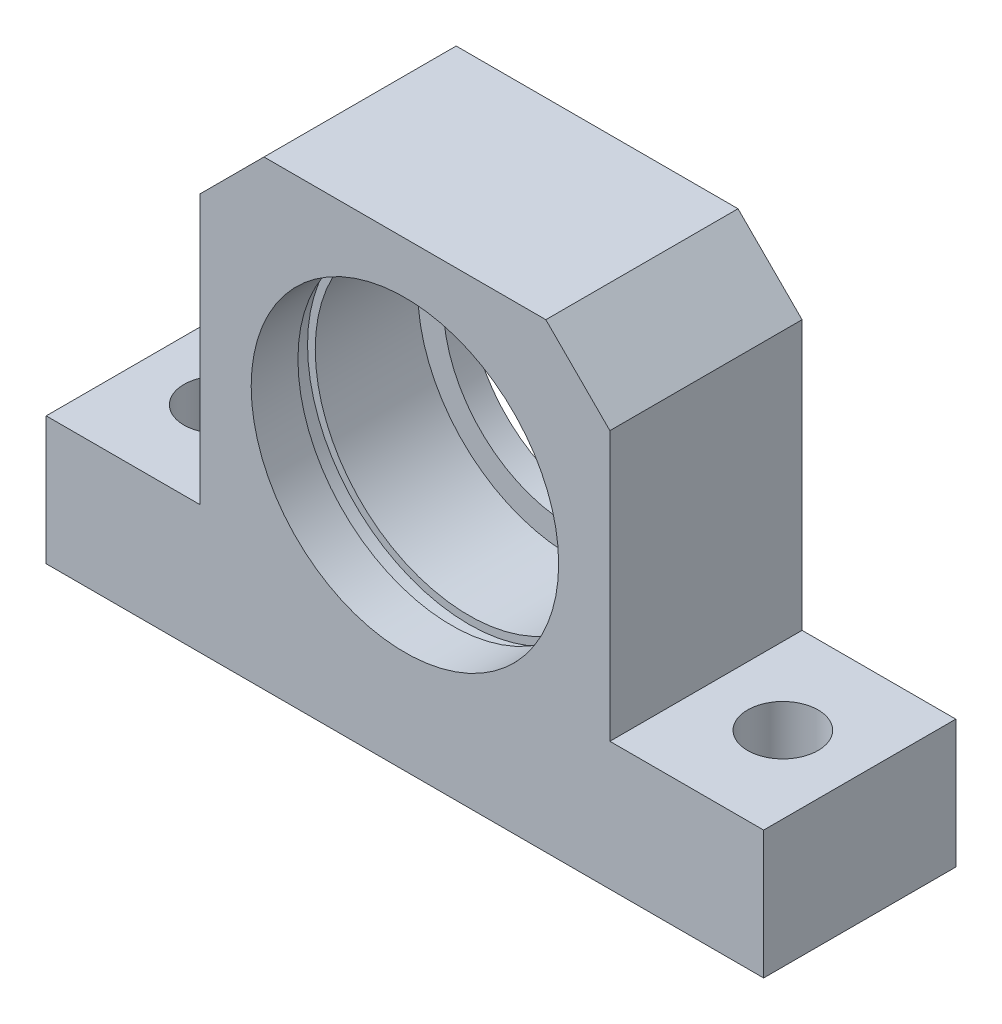
ISO-10303-21;
HEADER;
FILE_DESCRIPTION(('STEP AP214'),'2;1');
FILE_NAME('part.step','',(''),(''),'','','');
FILE_SCHEMA(('AUTOMOTIVE_DESIGN { 1 0 10303 214 1 1 1 1 }'));
ENDSEC;
DATA;
#1=APPLICATION_CONTEXT('core data for automotive mechanical design processes');
#2=APPLICATION_PROTOCOL_DEFINITION('international standard','automotive_design',2000,#1);
#3=PRODUCT_CONTEXT('',#1,'mechanical');
#4=PRODUCT('Part','Part','',(#3));
#5=PRODUCT_RELATED_PRODUCT_CATEGORY('part','',(#4));
#6=PRODUCT_DEFINITION_FORMATION('','',#4);
#7=PRODUCT_DEFINITION_CONTEXT('part definition',#1,'design');
#8=PRODUCT_DEFINITION('design','',#6,#7);
#9=PRODUCT_DEFINITION_SHAPE('','',#8);
#10=(LENGTH_UNIT() NAMED_UNIT(*) SI_UNIT(.MILLI.,.METRE.));
#11=(NAMED_UNIT(*) PLANE_ANGLE_UNIT() SI_UNIT($,.RADIAN.));
#12=(NAMED_UNIT(*) SI_UNIT($,.STERADIAN.) SOLID_ANGLE_UNIT());
#13=UNCERTAINTY_MEASURE_WITH_UNIT(LENGTH_MEASURE(1.E-05),#10,'distance_accuracy_value','');
#14=(GEOMETRIC_REPRESENTATION_CONTEXT(3) GLOBAL_UNCERTAINTY_ASSIGNED_CONTEXT((#13)) GLOBAL_UNIT_ASSIGNED_CONTEXT((#10,
#11,#12)) REPRESENTATION_CONTEXT('',''));
#15=CARTESIAN_POINT('',(0.,0.,0.));
#16=DIRECTION('',(0.,0.,1.));
#17=DIRECTION('',(1.,0.,0.));
#18=AXIS2_PLACEMENT_3D('',#15,#16,#17);
#19=CARTESIAN_POINT('',(28.,0.,-15.));
#20=DIRECTION('',(0.,-1.,0.));
#21=DIRECTION('',(0.,0.,-1.));
#22=AXIS2_PLACEMENT_3D('',#19,#20,#21);
#23=PLANE('',#22);
#24=CARTESIAN_POINT('',(-22.,0.,-7.5));
#25=DIRECTION('',(0.,1.,0.));
#26=DIRECTION('',(0.,0.,1.));
#27=AXIS2_PLACEMENT_3D('',#24,#25,#26);
#28=CIRCLE('',#27,2.75);
#29=CARTESIAN_POINT('',(-22.,0.,-4.75));
#30=VERTEX_POINT('',#29);
#31=EDGE_CURVE('E442',#30,#30,#28,.T.);
#32=ORIENTED_EDGE('',*,*,#31,.T.);
#33=EDGE_LOOP('',(#32));
#34=FACE_BOUND('',#33,.T.);
#35=DIRECTION('',(1.,0.,0.));
#36=VECTOR('',#35,1.);
#37=CARTESIAN_POINT('',(28.,0.,0.));
#38=LINE('',#37,#36);
#39=CARTESIAN_POINT('',(-28.,0.,0.));
#40=VERTEX_POINT('',#39);
#41=CARTESIAN_POINT('',(28.,0.,0.));
#42=VERTEX_POINT('',#41);
#43=EDGE_CURVE('E154',#40,#42,#38,.T.);
#44=ORIENTED_EDGE('',*,*,#43,.F.);
#45=DIRECTION('',(0.,0.,1.));
#46=VECTOR('',#45,1.);
#47=CARTESIAN_POINT('',(-28.,0.,-15.));
#48=LINE('',#47,#46);
#49=CARTESIAN_POINT('',(-28.,0.,-15.));
#50=VERTEX_POINT('',#49);
#51=EDGE_CURVE('E175',#50,#40,#48,.T.);
#52=ORIENTED_EDGE('',*,*,#51,.F.);
#53=DIRECTION('',(1.,0.,0.));
#54=VECTOR('',#53,1.);
#55=CARTESIAN_POINT('',(28.,0.,-15.));
#56=LINE('',#55,#54);
#57=CARTESIAN_POINT('',(28.,0.,-15.));
#58=VERTEX_POINT('',#57);
#59=EDGE_CURVE('E131',#50,#58,#56,.T.);
#60=ORIENTED_EDGE('',*,*,#59,.T.);
#61=DIRECTION('',(0.,0.,1.));
#62=VECTOR('',#61,1.);
#63=CARTESIAN_POINT('',(28.,0.,-15.));
#64=LINE('',#63,#62);
#65=EDGE_CURVE('E173',#58,#42,#64,.T.);
#66=ORIENTED_EDGE('',*,*,#65,.T.);
#67=EDGE_LOOP('',(#44,#52,#60,#66));
#68=FACE_BOUND('',#67,.T.);
#69=CARTESIAN_POINT('',(22.,0.,-7.5));
#70=DIRECTION('',(0.,1.,0.));
#71=DIRECTION('',(0.,0.,1.));
#72=AXIS2_PLACEMENT_3D('',#69,#70,#71);
#73=CIRCLE('',#72,2.75);
#74=CARTESIAN_POINT('',(22.,0.,-4.75));
#75=VERTEX_POINT('',#74);
#76=EDGE_CURVE('E436',#75,#75,#73,.T.);
#77=ORIENTED_EDGE('',*,*,#76,.T.);
#78=EDGE_LOOP('',(#77));
#79=FACE_BOUND('',#78,.T.);
#80=ADVANCED_FACE('F33',(#34,#68,#79),#23,.T.);
#81=CARTESIAN_POINT('',(-16.,9.99999999999999,-15.));
#82=DIRECTION('',(-1.,0.,0.));
#83=DIRECTION('',(0.,-1.,0.));
#84=AXIS2_PLACEMENT_3D('',#81,#82,#83);
#85=PLANE('',#84);
#86=DIRECTION('',(0.,-1.,0.));
#87=VECTOR('',#86,1.);
#88=CARTESIAN_POINT('',(-16.,9.99999999999999,0.));
#89=LINE('',#88,#87);
#90=CARTESIAN_POINT('',(-16.,31.,0.));
#91=VERTEX_POINT('',#90);
#92=CARTESIAN_POINT('',(-16.,9.99999999999999,0.));
#93=VERTEX_POINT('',#92);
#94=EDGE_CURVE('E147',#91,#93,#89,.T.);
#95=ORIENTED_EDGE('',*,*,#94,.F.);
#96=DIRECTION('',(0.,0.,-1.));
#97=VECTOR('',#96,1.);
#98=CARTESIAN_POINT('',(-16.,31.,-15.));
#99=LINE('',#98,#97);
#100=CARTESIAN_POINT('',(-16.,31.,-15.));
#101=VERTEX_POINT('',#100);
#102=EDGE_CURVE('E11',#91,#101,#99,.T.);
#103=ORIENTED_EDGE('',*,*,#102,.T.);
#104=DIRECTION('',(0.,-1.,0.));
#105=VECTOR('',#104,1.);
#106=CARTESIAN_POINT('',(-16.,9.99999999999999,-15.));
#107=LINE('',#106,#105);
#108=CARTESIAN_POINT('',(-16.,9.99999999999999,-15.));
#109=VERTEX_POINT('',#108);
#110=EDGE_CURVE('E108',#101,#109,#107,.T.);
#111=ORIENTED_EDGE('',*,*,#110,.T.);
#112=DIRECTION('',(0.,0.,1.));
#113=VECTOR('',#112,1.);
#114=CARTESIAN_POINT('',(-16.,9.99999999999999,-15.));
#115=LINE('',#114,#113);
#116=EDGE_CURVE('E111',#109,#93,#115,.T.);
#117=ORIENTED_EDGE('',*,*,#116,.T.);
#118=EDGE_LOOP('',(#95,#103,#111,#117));
#119=FACE_BOUND('',#118,.T.);
#120=ADVANCED_FACE('F110',(#119),#85,.T.);
#121=CARTESIAN_POINT('',(-16.,36.,-15.));
#122=DIRECTION('',(0.,1.,0.));
#123=DIRECTION('',(-1.,0.,0.));
#124=AXIS2_PLACEMENT_3D('',#121,#122,#123);
#125=PLANE('',#124);
#126=DIRECTION('',(-1.,0.,0.));
#127=VECTOR('',#126,1.);
#128=CARTESIAN_POINT('',(-16.,36.,0.));
#129=LINE('',#128,#127);
#130=CARTESIAN_POINT('',(11.,36.,0.));
#131=VERTEX_POINT('',#130);
#132=CARTESIAN_POINT('',(-11.,36.,0.));
#133=VERTEX_POINT('',#132);
#134=EDGE_CURVE('E115',#131,#133,#129,.T.);
#135=ORIENTED_EDGE('',*,*,#134,.F.);
#136=DIRECTION('',(0.,0.,-1.));
#137=VECTOR('',#136,1.);
#138=CARTESIAN_POINT('',(11.,36.,-15.));
#139=LINE('',#138,#137);
#140=CARTESIAN_POINT('',(11.,36.,-15.));
#141=VERTEX_POINT('',#140);
#142=EDGE_CURVE('E187',#131,#141,#139,.T.);
#143=ORIENTED_EDGE('',*,*,#142,.T.);
#144=DIRECTION('',(-1.,0.,0.));
#145=VECTOR('',#144,1.);
#146=CARTESIAN_POINT('',(-16.,36.,-15.));
#147=LINE('',#146,#145);
#148=CARTESIAN_POINT('',(-11.,36.,-15.));
#149=VERTEX_POINT('',#148);
#150=EDGE_CURVE('E123',#141,#149,#147,.T.);
#151=ORIENTED_EDGE('',*,*,#150,.T.);
#152=DIRECTION('',(0.,0.,1.));
#153=VECTOR('',#152,1.);
#154=CARTESIAN_POINT('',(-11.,36.,-15.));
#155=LINE('',#154,#153);
#156=EDGE_CURVE('E184',#149,#133,#155,.T.);
#157=ORIENTED_EDGE('',*,*,#156,.T.);
#158=EDGE_LOOP('',(#135,#143,#151,#157));
#159=FACE_BOUND('',#158,.T.);
#160=ADVANCED_FACE('F203',(#159),#125,.T.);
#161=CARTESIAN_POINT('',(16.,36.,-15.));
#162=DIRECTION('',(1.,0.,0.));
#163=DIRECTION('',(0.,1.,0.));
#164=AXIS2_PLACEMENT_3D('',#161,#162,#163);
#165=PLANE('',#164);
#166=DIRECTION('',(0.,1.,0.));
#167=VECTOR('',#166,1.);
#168=CARTESIAN_POINT('',(16.,36.,-15.));
#169=LINE('',#168,#167);
#170=CARTESIAN_POINT('',(16.,10.,-15.));
#171=VERTEX_POINT('',#170);
#172=CARTESIAN_POINT('',(16.,31.,-15.));
#173=VERTEX_POINT('',#172);
#174=EDGE_CURVE('E143',#171,#173,#169,.T.);
#175=ORIENTED_EDGE('',*,*,#174,.T.);
#176=DIRECTION('',(0.,0.,1.));
#177=VECTOR('',#176,1.);
#178=CARTESIAN_POINT('',(16.,31.,-15.));
#179=LINE('',#178,#177);
#180=CARTESIAN_POINT('',(16.,31.,0.));
#181=VERTEX_POINT('',#180);
#182=EDGE_CURVE('E170',#173,#181,#179,.T.);
#183=ORIENTED_EDGE('',*,*,#182,.T.);
#184=DIRECTION('',(0.,1.,0.));
#185=VECTOR('',#184,1.);
#186=CARTESIAN_POINT('',(16.,36.,0.));
#187=LINE('',#186,#185);
#188=CARTESIAN_POINT('',(16.,10.,0.));
#189=VERTEX_POINT('',#188);
#190=EDGE_CURVE('E163',#189,#181,#187,.T.);
#191=ORIENTED_EDGE('',*,*,#190,.F.);
#192=DIRECTION('',(0.,0.,1.));
#193=VECTOR('',#192,1.);
#194=CARTESIAN_POINT('',(16.,10.,-15.));
#195=LINE('',#194,#193);
#196=EDGE_CURVE('E168',#171,#189,#195,.T.);
#197=ORIENTED_EDGE('',*,*,#196,.F.);
#198=EDGE_LOOP('',(#175,#183,#191,#197));
#199=FACE_BOUND('',#198,.T.);
#200=ADVANCED_FACE('F196',(#199),#165,.T.);
#201=CARTESIAN_POINT('',(16.,10.,-15.));
#202=DIRECTION('',(0.,1.,0.));
#203=DIRECTION('',(-1.,0.,0.));
#204=AXIS2_PLACEMENT_3D('',#201,#202,#203);
#205=PLANE('',#204);
#206=CARTESIAN_POINT('',(22.,10.,-7.5));
#207=DIRECTION('',(0.,1.,0.));
#208=DIRECTION('',(0.,0.,1.));
#209=AXIS2_PLACEMENT_3D('',#206,#207,#208);
#210=CIRCLE('',#209,2.74999999999999);
#211=CARTESIAN_POINT('',(22.,10.,-4.75000000000001));
#212=VERTEX_POINT('',#211);
#213=EDGE_CURVE('E439',#212,#212,#210,.T.);
#214=ORIENTED_EDGE('',*,*,#213,.F.);
#215=EDGE_LOOP('',(#214));
#216=FACE_BOUND('',#215,.T.);
#217=DIRECTION('',(-1.,0.,0.));
#218=VECTOR('',#217,1.);
#219=CARTESIAN_POINT('',(16.,10.,0.));
#220=LINE('',#219,#218);
#221=CARTESIAN_POINT('',(28.,9.99999999999999,0.));
#222=VERTEX_POINT('',#221);
#223=EDGE_CURVE('E160',#222,#189,#220,.T.);
#224=ORIENTED_EDGE('',*,*,#223,.F.);
#225=DIRECTION('',(0.,0.,1.));
#226=VECTOR('',#225,1.);
#227=CARTESIAN_POINT('',(28.,9.99999999999999,-15.));
#228=LINE('',#227,#226);
#229=CARTESIAN_POINT('',(28.,9.99999999999999,-15.));
#230=VERTEX_POINT('',#229);
#231=EDGE_CURVE('E171',#230,#222,#228,.T.);
#232=ORIENTED_EDGE('',*,*,#231,.F.);
#233=DIRECTION('',(-1.,0.,0.));
#234=VECTOR('',#233,1.);
#235=CARTESIAN_POINT('',(16.,10.,-15.));
#236=LINE('',#235,#234);
#237=EDGE_CURVE('E140',#230,#171,#236,.T.);
#238=ORIENTED_EDGE('',*,*,#237,.T.);
#239=ORIENTED_EDGE('',*,*,#196,.T.);
#240=EDGE_LOOP('',(#224,#232,#238,#239));
#241=FACE_BOUND('',#240,.T.);
#242=ADVANCED_FACE('F218',(#216,#241),#205,.T.);
#243=CARTESIAN_POINT('',(28.,9.99999999999999,-15.));
#244=DIRECTION('',(1.,0.,0.));
#245=DIRECTION('',(0.,0.,-1.));
#246=AXIS2_PLACEMENT_3D('',#243,#244,#245);
#247=PLANE('',#246);
#248=DIRECTION('',(0.,1.,0.));
#249=VECTOR('',#248,1.);
#250=CARTESIAN_POINT('',(28.,9.99999999999999,0.));
#251=LINE('',#250,#249);
#252=EDGE_CURVE('E157',#42,#222,#251,.T.);
#253=ORIENTED_EDGE('',*,*,#252,.F.);
#254=ORIENTED_EDGE('',*,*,#65,.F.);
#255=DIRECTION('',(0.,1.,0.));
#256=VECTOR('',#255,1.);
#257=CARTESIAN_POINT('',(28.,9.99999999999999,-15.));
#258=LINE('',#257,#256);
#259=EDGE_CURVE('E137',#58,#230,#258,.T.);
#260=ORIENTED_EDGE('',*,*,#259,.T.);
#261=ORIENTED_EDGE('',*,*,#231,.T.);
#262=EDGE_LOOP('',(#253,#254,#260,#261));
#263=FACE_BOUND('',#262,.T.);
#264=ADVANCED_FACE('F215',(#263),#247,.T.);
#265=CARTESIAN_POINT('',(-28.,0.,-15.));
#266=DIRECTION('',(-1.,0.,0.));
#267=DIRECTION('',(0.,0.,1.));
#268=AXIS2_PLACEMENT_3D('',#265,#266,#267);
#269=PLANE('',#268);
#270=DIRECTION('',(0.,-1.,0.));
#271=VECTOR('',#270,1.);
#272=CARTESIAN_POINT('',(-28.,0.,0.));
#273=LINE('',#272,#271);
#274=CARTESIAN_POINT('',(-28.,9.99999999999999,0.));
#275=VERTEX_POINT('',#274);
#276=EDGE_CURVE('E151',#275,#40,#273,.T.);
#277=ORIENTED_EDGE('',*,*,#276,.F.);
#278=DIRECTION('',(0.,0.,1.));
#279=VECTOR('',#278,1.);
#280=CARTESIAN_POINT('',(-28.,9.99999999999999,-15.));
#281=LINE('',#280,#279);
#282=CARTESIAN_POINT('',(-28.,9.99999999999999,-15.));
#283=VERTEX_POINT('',#282);
#284=EDGE_CURVE('E122',#283,#275,#281,.T.);
#285=ORIENTED_EDGE('',*,*,#284,.F.);
#286=DIRECTION('',(0.,-1.,0.));
#287=VECTOR('',#286,1.);
#288=CARTESIAN_POINT('',(-28.,0.,-15.));
#289=LINE('',#288,#287);
#290=EDGE_CURVE('E129',#283,#50,#289,.T.);
#291=ORIENTED_EDGE('',*,*,#290,.T.);
#292=ORIENTED_EDGE('',*,*,#51,.T.);
#293=EDGE_LOOP('',(#277,#285,#291,#292));
#294=FACE_BOUND('',#293,.T.);
#295=ADVANCED_FACE('F209',(#294),#269,.T.);
#296=CARTESIAN_POINT('',(-28.,9.99999999999999,-15.));
#297=DIRECTION('',(0.,1.,0.));
#298=DIRECTION('',(0.,0.,1.));
#299=AXIS2_PLACEMENT_3D('',#296,#297,#298);
#300=PLANE('',#299);
#301=CARTESIAN_POINT('',(-22.,10.,-7.5));
#302=DIRECTION('',(0.,1.,0.));
#303=DIRECTION('',(0.,0.,1.));
#304=AXIS2_PLACEMENT_3D('',#301,#302,#303);
#305=CIRCLE('',#304,2.74999999999999);
#306=CARTESIAN_POINT('',(-22.,10.,-4.75000000000001));
#307=VERTEX_POINT('',#306);
#308=EDGE_CURVE('E444',#307,#307,#305,.T.);
#309=ORIENTED_EDGE('',*,*,#308,.F.);
#310=EDGE_LOOP('',(#309));
#311=FACE_BOUND('',#310,.T.);
#312=DIRECTION('',(-1.,0.,0.));
#313=VECTOR('',#312,1.);
#314=CARTESIAN_POINT('',(-28.,9.99999999999999,0.));
#315=LINE('',#314,#313);
#316=EDGE_CURVE('E121',#93,#275,#315,.T.);
#317=ORIENTED_EDGE('',*,*,#316,.F.);
#318=ORIENTED_EDGE('',*,*,#116,.F.);
#319=DIRECTION('',(-1.,0.,0.));
#320=VECTOR('',#319,1.);
#321=CARTESIAN_POINT('',(-28.,9.99999999999999,-15.));
#322=LINE('',#321,#320);
#323=EDGE_CURVE('E114',#109,#283,#322,.T.);
#324=ORIENTED_EDGE('',*,*,#323,.T.);
#325=ORIENTED_EDGE('',*,*,#284,.T.);
#326=EDGE_LOOP('',(#317,#318,#324,#325));
#327=FACE_BOUND('',#326,.T.);
#328=ADVANCED_FACE('F119',(#311,#327),#300,.T.);
#329=CARTESIAN_POINT('',(0.,0.,-15.));
#330=DIRECTION('',(0.,0.,-1.));
#331=DIRECTION('',(-1.,0.,0.));
#332=AXIS2_PLACEMENT_3D('',#329,#330,#331);
#333=PLANE('',#332);
#334=CARTESIAN_POINT('',(0.,20.,-15.));
#335=DIRECTION('',(0.,0.,-1.));
#336=DIRECTION('',(-1.,0.,0.));
#337=AXIS2_PLACEMENT_3D('',#334,#335,#336);
#338=CIRCLE('',#337,10.);
#339=CARTESIAN_POINT('',(-10.,20.,-15.));
#340=VERTEX_POINT('',#339);
#341=EDGE_CURVE('E414',#340,#340,#338,.T.);
#342=ORIENTED_EDGE('',*,*,#341,.F.);
#343=EDGE_LOOP('',(#342));
#344=FACE_BOUND('',#343,.T.);
#345=ORIENTED_EDGE('',*,*,#150,.F.);
#346=DIRECTION('',(-0.70710678118655,0.707106781186546,0.));
#347=VECTOR('',#346,1.);
#348=CARTESIAN_POINT('',(23.5,23.5000000000001,-15.));
#349=LINE('',#348,#347);
#350=EDGE_CURVE('E41',#141,#173,#349,.F.);
#351=ORIENTED_EDGE('',*,*,#350,.T.);
#352=ORIENTED_EDGE('',*,*,#174,.F.);
#353=ORIENTED_EDGE('',*,*,#237,.F.);
#354=ORIENTED_EDGE('',*,*,#259,.F.);
#355=ORIENTED_EDGE('',*,*,#59,.F.);
#356=ORIENTED_EDGE('',*,*,#290,.F.);
#357=ORIENTED_EDGE('',*,*,#323,.F.);
#358=ORIENTED_EDGE('',*,*,#110,.F.);
#359=DIRECTION('',(-0.707106781186546,-0.707106781186549,0.));
#360=VECTOR('',#359,1.);
#361=CARTESIAN_POINT('',(-23.5,23.4999999999999,-15.));
#362=LINE('',#361,#360);
#363=EDGE_CURVE('E53',#101,#149,#362,.F.);
#364=ORIENTED_EDGE('',*,*,#363,.T.);
#365=EDGE_LOOP('',(#345,#351,#352,#353,#354,#355,#356,#357,#358,#364));
#366=FACE_BOUND('',#365,.T.);
#367=ADVANCED_FACE('F126',(#344,#366),#333,.T.);
#368=CARTESIAN_POINT('',(0.,0.,0.));
#369=DIRECTION('',(0.,0.,-1.));
#370=DIRECTION('',(-1.,0.,0.));
#371=AXIS2_PLACEMENT_3D('',#368,#369,#370);
#372=PLANE('',#371);
#373=CARTESIAN_POINT('',(0.,20.,0.));
#374=DIRECTION('',(0.,0.,-1.));
#375=DIRECTION('',(-1.,0.,0.));
#376=AXIS2_PLACEMENT_3D('',#373,#374,#375);
#377=CIRCLE('',#376,12.);
#378=CARTESIAN_POINT('',(-12.,20.,0.));
#379=VERTEX_POINT('',#378);
#380=EDGE_CURVE('E149',#379,#379,#377,.T.);
#381=ORIENTED_EDGE('',*,*,#380,.T.);
#382=EDGE_LOOP('',(#381));
#383=FACE_BOUND('',#382,.T.);
#384=ORIENTED_EDGE('',*,*,#190,.T.);
#385=DIRECTION('',(0.70710678118655,-0.707106781186546,0.));
#386=VECTOR('',#385,1.);
#387=CARTESIAN_POINT('',(16.,31.,0.));
#388=LINE('',#387,#386);
#389=EDGE_CURVE('E182',#181,#131,#388,.F.);
#390=ORIENTED_EDGE('',*,*,#389,.T.);
#391=ORIENTED_EDGE('',*,*,#134,.T.);
#392=DIRECTION('',(0.707106781186546,0.707106781186549,0.));
#393=VECTOR('',#392,1.);
#394=CARTESIAN_POINT('',(-11.,36.,0.));
#395=LINE('',#394,#393);
#396=EDGE_CURVE('E180',#133,#91,#395,.F.);
#397=ORIENTED_EDGE('',*,*,#396,.T.);
#398=ORIENTED_EDGE('',*,*,#94,.T.);
#399=ORIENTED_EDGE('',*,*,#316,.T.);
#400=ORIENTED_EDGE('',*,*,#276,.T.);
#401=ORIENTED_EDGE('',*,*,#43,.T.);
#402=ORIENTED_EDGE('',*,*,#252,.T.);
#403=ORIENTED_EDGE('',*,*,#223,.T.);
#404=EDGE_LOOP('',(#384,#390,#391,#397,#398,#399,#400,#401,#402,#403));
#405=FACE_BOUND('',#404,.T.);
#406=ADVANCED_FACE('F201',(#383,#405),#372,.F.);
#407=CARTESIAN_POINT('',(0.,20.,-15.));
#408=DIRECTION('',(0.,0.,-1.));
#409=DIRECTION('',(-1.,0.,0.));
#410=AXIS2_PLACEMENT_3D('',#407,#408,#409);
#411=CYLINDRICAL_SURFACE('',#410,12.);
#412=ORIENTED_EDGE('',*,*,#380,.F.);
#413=EDGE_LOOP('',(#412));
#414=FACE_BOUND('',#413,.T.);
#415=CARTESIAN_POINT('',(0.,20.,-3.65));
#416=DIRECTION('',(0.,0.,-1.));
#417=DIRECTION('',(-1.,0.,0.));
#418=AXIS2_PLACEMENT_3D('',#415,#416,#417);
#419=CIRCLE('',#418,12.);
#420=CARTESIAN_POINT('',(-12.,20.,-3.65));
#421=VERTEX_POINT('',#420);
#422=EDGE_CURVE('E433',#421,#421,#419,.T.);
#423=ORIENTED_EDGE('',*,*,#422,.T.);
#424=EDGE_LOOP('',(#423));
#425=FACE_BOUND('',#424,.T.);
#426=ADVANCED_FACE('F282',(#414,#425),#411,.F.);
#427=CARTESIAN_POINT('',(0.,20.,-15.));
#428=DIRECTION('',(0.,0.,-1.));
#429=DIRECTION('',(-1.,0.,0.));
#430=AXIS2_PLACEMENT_3D('',#427,#428,#429);
#431=CYLINDRICAL_SURFACE('',#430,10.);
#432=CARTESIAN_POINT('',(0.,20.,-13.));
#433=DIRECTION('',(0.,0.,-1.));
#434=DIRECTION('',(-1.,0.,0.));
#435=AXIS2_PLACEMENT_3D('',#432,#433,#434);
#436=CIRCLE('',#435,10.);
#437=CARTESIAN_POINT('',(-10.,20.,-13.));
#438=VERTEX_POINT('',#437);
#439=EDGE_CURVE('E416',#438,#438,#436,.T.);
#440=ORIENTED_EDGE('',*,*,#439,.F.);
#441=EDGE_LOOP('',(#440));
#442=FACE_BOUND('',#441,.T.);
#443=ORIENTED_EDGE('',*,*,#341,.T.);
#444=EDGE_LOOP('',(#443));
#445=FACE_BOUND('',#444,.T.);
#446=ADVANCED_FACE('F278',(#442,#445),#431,.F.);
#447=CARTESIAN_POINT('',(0.,32.,-13.));
#448=DIRECTION('',(0.,0.,-1.));
#449=DIRECTION('',(-1.,0.,0.));
#450=AXIS2_PLACEMENT_3D('',#447,#448,#449);
#451=PLANE('',#450);
#452=CARTESIAN_POINT('',(0.,20.,-13.));
#453=DIRECTION('',(0.,0.,-1.));
#454=DIRECTION('',(-1.,0.,0.));
#455=AXIS2_PLACEMENT_3D('',#452,#453,#454);
#456=CIRCLE('',#455,12.);
#457=CARTESIAN_POINT('',(-12.,20.,-13.));
#458=VERTEX_POINT('',#457);
#459=EDGE_CURVE('E421',#458,#458,#456,.T.);
#460=ORIENTED_EDGE('',*,*,#459,.F.);
#461=EDGE_LOOP('',(#460));
#462=FACE_BOUND('',#461,.T.);
#463=ORIENTED_EDGE('',*,*,#439,.T.);
#464=EDGE_LOOP('',(#463));
#465=FACE_BOUND('',#464,.T.);
#466=ADVANCED_FACE('F274',(#462,#465),#451,.F.);
#467=CARTESIAN_POINT('',(0.,20.,-15.));
#468=DIRECTION('',(0.,0.,-1.));
#469=DIRECTION('',(-1.,0.,0.));
#470=AXIS2_PLACEMENT_3D('',#467,#468,#469);
#471=CYLINDRICAL_SURFACE('',#470,12.);
#472=CARTESIAN_POINT('',(0.,20.,-5.));
#473=DIRECTION('',(0.,0.,-1.));
#474=DIRECTION('',(-1.,0.,0.));
#475=AXIS2_PLACEMENT_3D('',#472,#473,#474);
#476=CIRCLE('',#475,12.);
#477=CARTESIAN_POINT('',(-12.,20.,-5.));
#478=VERTEX_POINT('',#477);
#479=EDGE_CURVE('E424',#478,#478,#476,.T.);
#480=ORIENTED_EDGE('',*,*,#479,.F.);
#481=EDGE_LOOP('',(#480));
#482=FACE_BOUND('',#481,.T.);
#483=ORIENTED_EDGE('',*,*,#459,.T.);
#484=EDGE_LOOP('',(#483));
#485=FACE_BOUND('',#484,.T.);
#486=ADVANCED_FACE('F270',(#482,#485),#471,.F.);
#487=CARTESIAN_POINT('',(0.,32.6,-5.));
#488=DIRECTION('',(0.,0.,-1.));
#489=DIRECTION('',(-1.,0.,0.));
#490=AXIS2_PLACEMENT_3D('',#487,#488,#489);
#491=PLANE('',#490);
#492=CARTESIAN_POINT('',(0.,20.,-5.));
#493=DIRECTION('',(0.,0.,-1.));
#494=DIRECTION('',(-1.,0.,0.));
#495=AXIS2_PLACEMENT_3D('',#492,#493,#494);
#496=CIRCLE('',#495,12.6);
#497=CARTESIAN_POINT('',(-12.6,20.,-5.));
#498=VERTEX_POINT('',#497);
#499=EDGE_CURVE('E427',#498,#498,#496,.T.);
#500=ORIENTED_EDGE('',*,*,#499,.F.);
#501=EDGE_LOOP('',(#500));
#502=FACE_BOUND('',#501,.T.);
#503=ORIENTED_EDGE('',*,*,#479,.T.);
#504=EDGE_LOOP('',(#503));
#505=FACE_BOUND('',#504,.T.);
#506=ADVANCED_FACE('F266',(#502,#505),#491,.F.);
#507=CARTESIAN_POINT('',(0.,20.,-15.));
#508=DIRECTION('',(0.,0.,-1.));
#509=DIRECTION('',(-1.,0.,0.));
#510=AXIS2_PLACEMENT_3D('',#507,#508,#509);
#511=CYLINDRICAL_SURFACE('',#510,12.6);
#512=CARTESIAN_POINT('',(0.,20.,-3.65));
#513=DIRECTION('',(0.,0.,-1.));
#514=DIRECTION('',(-1.,0.,0.));
#515=AXIS2_PLACEMENT_3D('',#512,#513,#514);
#516=CIRCLE('',#515,12.6);
#517=CARTESIAN_POINT('',(-12.6,20.,-3.65));
#518=VERTEX_POINT('',#517);
#519=EDGE_CURVE('E430',#518,#518,#516,.T.);
#520=ORIENTED_EDGE('',*,*,#519,.F.);
#521=EDGE_LOOP('',(#520));
#522=FACE_BOUND('',#521,.T.);
#523=ORIENTED_EDGE('',*,*,#499,.T.);
#524=EDGE_LOOP('',(#523));
#525=FACE_BOUND('',#524,.T.);
#526=ADVANCED_FACE('F262',(#522,#525),#511,.F.);
#527=CARTESIAN_POINT('',(0.,32.,-3.65));
#528=DIRECTION('',(0.,0.,1.));
#529=DIRECTION('',(1.,0.,0.));
#530=AXIS2_PLACEMENT_3D('',#527,#528,#529);
#531=PLANE('',#530);
#532=ORIENTED_EDGE('',*,*,#422,.F.);
#533=EDGE_LOOP('',(#532));
#534=FACE_BOUND('',#533,.T.);
#535=ORIENTED_EDGE('',*,*,#519,.T.);
#536=EDGE_LOOP('',(#535));
#537=FACE_BOUND('',#536,.T.);
#538=ADVANCED_FACE('F254',(#534,#537),#531,.F.);
#539=CARTESIAN_POINT('',(22.,9.99999999999999,-7.5));
#540=DIRECTION('',(0.,1.,0.));
#541=DIRECTION('',(0.,0.,1.));
#542=AXIS2_PLACEMENT_3D('',#539,#540,#541);
#543=CYLINDRICAL_SURFACE('',#542,2.74999999999999);
#544=ORIENTED_EDGE('',*,*,#76,.F.);
#545=EDGE_LOOP('',(#544));
#546=FACE_BOUND('',#545,.T.);
#547=ORIENTED_EDGE('',*,*,#213,.T.);
#548=EDGE_LOOP('',(#547));
#549=FACE_BOUND('',#548,.T.);
#550=ADVANCED_FACE('F248',(#546,#549),#543,.F.);
#551=CARTESIAN_POINT('',(-22.,9.99999999999999,-7.5));
#552=DIRECTION('',(0.,1.,0.));
#553=DIRECTION('',(0.,0.,1.));
#554=AXIS2_PLACEMENT_3D('',#551,#552,#553);
#555=CYLINDRICAL_SURFACE('',#554,2.74999999999999);
#556=ORIENTED_EDGE('',*,*,#31,.F.);
#557=EDGE_LOOP('',(#556));
#558=FACE_BOUND('',#557,.T.);
#559=ORIENTED_EDGE('',*,*,#308,.T.);
#560=EDGE_LOOP('',(#559));
#561=FACE_BOUND('',#560,.T.);
#562=ADVANCED_FACE('F243',(#558,#561),#555,.F.);
#563=CARTESIAN_POINT('',(16.,31.,-15.));
#564=DIRECTION('',(-0.707106781186545,-0.707106781186549,0.));
#565=DIRECTION('',(0.,0.,1.));
#566=AXIS2_PLACEMENT_3D('',#563,#564,#565);
#567=PLANE('',#566);
#568=ORIENTED_EDGE('',*,*,#350,.F.);
#569=ORIENTED_EDGE('',*,*,#142,.F.);
#570=ORIENTED_EDGE('',*,*,#389,.F.);
#571=ORIENTED_EDGE('',*,*,#182,.F.);
#572=EDGE_LOOP('',(#568,#569,#570,#571));
#573=FACE_BOUND('',#572,.T.);
#574=ADVANCED_FACE('F198',(#573),#567,.F.);
#575=CARTESIAN_POINT('',(-11.,36.,-15.));
#576=DIRECTION('',(0.707106781186549,-0.707106781186546,0.));
#577=DIRECTION('',(0.,0.,1.));
#578=AXIS2_PLACEMENT_3D('',#575,#576,#577);
#579=PLANE('',#578);
#580=ORIENTED_EDGE('',*,*,#363,.F.);
#581=ORIENTED_EDGE('',*,*,#102,.F.);
#582=ORIENTED_EDGE('',*,*,#396,.F.);
#583=ORIENTED_EDGE('',*,*,#156,.F.);
#584=EDGE_LOOP('',(#580,#581,#582,#583));
#585=FACE_BOUND('',#584,.T.);
#586=ADVANCED_FACE('F35',(#585),#579,.F.);
#587=CLOSED_SHELL('',(#80,#120,#160,#200,#242,#264,#295,#328,#367,#406,#426,#446,#466,#486,#506,
#526,#538,#550,#562,#574,#586));
#588=MANIFOLD_SOLID_BREP('B2',#587);
#589=ADVANCED_BREP_SHAPE_REPRESENTATION('',(#18,#588),#14);
#590=SHAPE_DEFINITION_REPRESENTATION(#9,#589);
ENDSEC;
END-ISO-10303-21;
